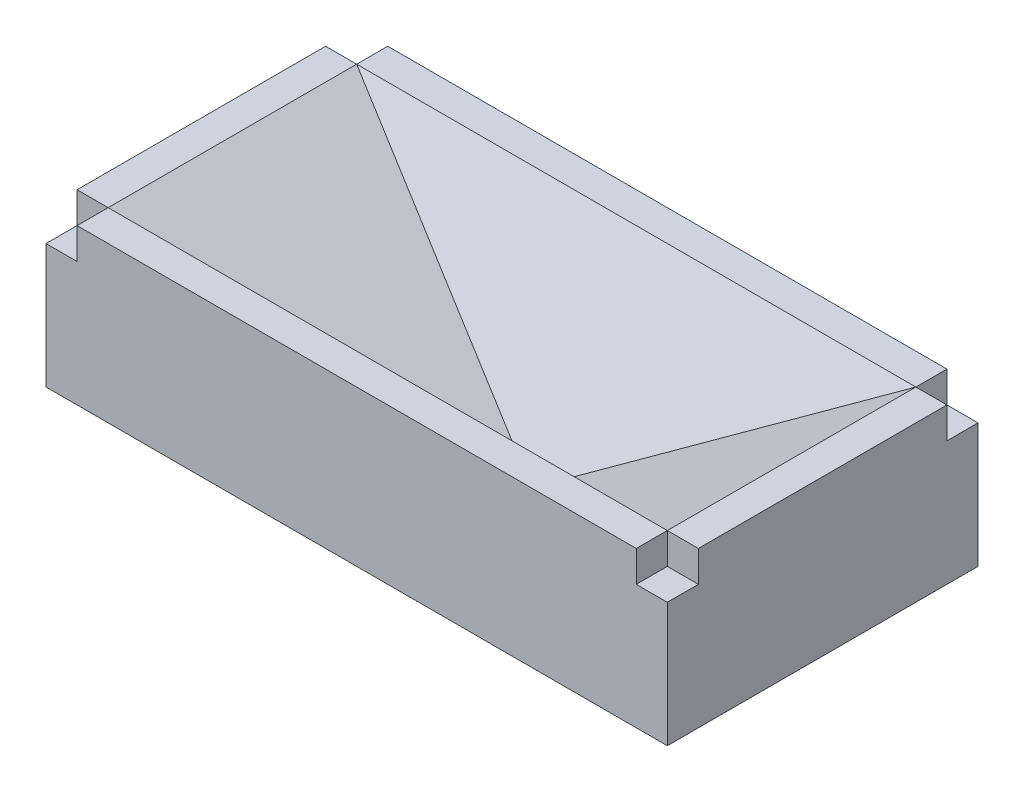
ISO-10303-21;
HEADER;
FILE_DESCRIPTION(('STEP AP214'),'2;1');
FILE_NAME('part.step','',(''),(''),'','','');
FILE_SCHEMA(('AUTOMOTIVE_DESIGN { 1 0 10303 214 1 1 1 1 }'));
ENDSEC;
DATA;
#1=APPLICATION_CONTEXT('core data for automotive mechanical design processes');
#2=APPLICATION_PROTOCOL_DEFINITION('international standard','automotive_design',2000,#1);
#3=PRODUCT_CONTEXT('',#1,'mechanical');
#4=PRODUCT('Part','Part','',(#3));
#5=PRODUCT_RELATED_PRODUCT_CATEGORY('part','',(#4));
#6=PRODUCT_DEFINITION_FORMATION('','',#4);
#7=PRODUCT_DEFINITION_CONTEXT('part definition',#1,'design');
#8=PRODUCT_DEFINITION('design','',#6,#7);
#9=PRODUCT_DEFINITION_SHAPE('','',#8);
#10=(LENGTH_UNIT() NAMED_UNIT(*) SI_UNIT(.MILLI.,.METRE.));
#11=(NAMED_UNIT(*) PLANE_ANGLE_UNIT() SI_UNIT($,.RADIAN.));
#12=(NAMED_UNIT(*) SI_UNIT($,.STERADIAN.) SOLID_ANGLE_UNIT());
#13=UNCERTAINTY_MEASURE_WITH_UNIT(LENGTH_MEASURE(1.E-05),#10,'distance_accuracy_value','');
#14=(GEOMETRIC_REPRESENTATION_CONTEXT(3) GLOBAL_UNCERTAINTY_ASSIGNED_CONTEXT((#13)) GLOBAL_UNIT_ASSIGNED_CONTEXT((#10,
#11,#12)) REPRESENTATION_CONTEXT('',''));
#15=CARTESIAN_POINT('',(0.,0.,0.));
#16=DIRECTION('',(0.,0.,1.));
#17=DIRECTION('',(1.,0.,0.));
#18=AXIS2_PLACEMENT_3D('',#15,#16,#17);
#19=CARTESIAN_POINT('',(0.,0.,0.));
#20=DIRECTION('',(0.,1.,0.));
#21=DIRECTION('',(0.,0.,1.));
#22=AXIS2_PLACEMENT_3D('',#19,#20,#21);
#23=PLANE('',#22);
#24=DIRECTION('',(1.,0.,0.));
#25=VECTOR('',#24,1.);
#26=CARTESIAN_POINT('',(45.,0.,-20.));
#27=LINE('',#26,#25);
#28=CARTESIAN_POINT('',(45.,0.,-20.));
#29=VERTEX_POINT('',#28);
#30=CARTESIAN_POINT('',(50.0000000000001,0.,-20.));
#31=VERTEX_POINT('',#30);
#32=EDGE_CURVE('E312',#29,#31,#27,.T.);
#33=ORIENTED_EDGE('',*,*,#32,.F.);
#34=DIRECTION('',(0.,0.,-1.));
#35=VECTOR('',#34,1.);
#36=CARTESIAN_POINT('',(45.,0.,-20.));
#37=LINE('',#36,#35);
#38=CARTESIAN_POINT('',(45.,0.,20.));
#39=VERTEX_POINT('',#38);
#40=EDGE_CURVE('E53',#39,#29,#37,.T.);
#41=ORIENTED_EDGE('',*,*,#40,.F.);
#42=DIRECTION('',(-1.,0.,0.));
#43=VECTOR('',#42,1.);
#44=CARTESIAN_POINT('',(50.0000000000001,0.,20.));
#45=LINE('',#44,#43);
#46=CARTESIAN_POINT('',(50.0000000000001,0.,20.));
#47=VERTEX_POINT('',#46);
#48=EDGE_CURVE('E778',#47,#39,#45,.T.);
#49=ORIENTED_EDGE('',*,*,#48,.F.);
#50=DIRECTION('',(0.,0.,-1.));
#51=VECTOR('',#50,1.);
#52=CARTESIAN_POINT('',(50.0000000000001,0.,-25.));
#53=LINE('',#52,#51);
#54=EDGE_CURVE('E739',#47,#31,#53,.T.);
#55=ORIENTED_EDGE('',*,*,#54,.T.);
#56=EDGE_LOOP('',(#33,#41,#49,#55));
#57=FACE_BOUND('',#56,.T.);
#58=ADVANCED_FACE('F49',(#57),#23,.T.);
#59=DIRECTION('',(0.,0.,1.));
#60=VECTOR('',#59,1.);
#61=CARTESIAN_POINT('',(45.,0.,-25.));
#62=LINE('',#61,#60);
#63=CARTESIAN_POINT('',(45.,0.,-25.));
#64=VERTEX_POINT('',#63);
#65=EDGE_CURVE('E806',#64,#29,#62,.T.);
#66=ORIENTED_EDGE('',*,*,#65,.F.);
#67=DIRECTION('',(-1.,0.,0.));
#68=VECTOR('',#67,1.);
#69=CARTESIAN_POINT('',(-50.,0.,-25.));
#70=LINE('',#69,#68);
#71=CARTESIAN_POINT('',(-44.9999999999999,0.,-25.));
#72=VERTEX_POINT('',#71);
#73=EDGE_CURVE('E735',#64,#72,#70,.T.);
#74=ORIENTED_EDGE('',*,*,#73,.T.);
#75=DIRECTION('',(0.,0.,-1.));
#76=VECTOR('',#75,1.);
#77=CARTESIAN_POINT('',(-44.9999999999999,0.,-25.));
#78=LINE('',#77,#76);
#79=CARTESIAN_POINT('',(-45.,0.,-20.));
#80=VERTEX_POINT('',#79);
#81=EDGE_CURVE('E289',#80,#72,#78,.T.);
#82=ORIENTED_EDGE('',*,*,#81,.F.);
#83=DIRECTION('',(-1.,0.,0.));
#84=VECTOR('',#83,1.);
#85=CARTESIAN_POINT('',(-45.,0.,-20.));
#86=LINE('',#85,#84);
#87=EDGE_CURVE('E483',#29,#80,#86,.T.);
#88=ORIENTED_EDGE('',*,*,#87,.F.);
#89=EDGE_LOOP('',(#66,#74,#82,#88));
#90=FACE_BOUND('',#89,.T.);
#91=ADVANCED_FACE('F833',(#90),#23,.T.);
#92=DIRECTION('',(1.,0.,0.));
#93=VECTOR('',#92,1.);
#94=CARTESIAN_POINT('',(-45.,0.,-20.));
#95=LINE('',#94,#93);
#96=CARTESIAN_POINT('',(-50.,0.,-20.));
#97=VERTEX_POINT('',#96);
#98=EDGE_CURVE('E329',#97,#80,#95,.T.);
#99=ORIENTED_EDGE('',*,*,#98,.F.);
#100=DIRECTION('',(0.,0.,1.));
#101=VECTOR('',#100,1.);
#102=CARTESIAN_POINT('',(-50.,0.,-25.));
#103=LINE('',#102,#101);
#104=CARTESIAN_POINT('',(-50.,0.,20.));
#105=VERTEX_POINT('',#104);
#106=EDGE_CURVE('E731',#97,#105,#103,.T.);
#107=ORIENTED_EDGE('',*,*,#106,.T.);
#108=DIRECTION('',(-1.,0.,0.));
#109=VECTOR('',#108,1.);
#110=CARTESIAN_POINT('',(-50.,0.,20.));
#111=LINE('',#110,#109);
#112=CARTESIAN_POINT('',(-44.9999999999999,0.,20.));
#113=VERTEX_POINT('',#112);
#114=EDGE_CURVE('E268',#113,#105,#111,.T.);
#115=ORIENTED_EDGE('',*,*,#114,.F.);
#116=DIRECTION('',(0.,0.,1.));
#117=VECTOR('',#116,1.);
#118=CARTESIAN_POINT('',(-45.,0.,-20.));
#119=LINE('',#118,#117);
#120=EDGE_CURVE('E585',#80,#113,#119,.T.);
#121=ORIENTED_EDGE('',*,*,#120,.F.);
#122=EDGE_LOOP('',(#99,#107,#115,#121));
#123=FACE_BOUND('',#122,.T.);
#124=ADVANCED_FACE('F645',(#123),#23,.T.);
#125=CARTESIAN_POINT('',(0.,-25.,0.));
#126=DIRECTION('',(0.,1.,0.));
#127=DIRECTION('',(0.,0.,1.));
#128=AXIS2_PLACEMENT_3D('',#125,#126,#127);
#129=PLANE('',#128);
#130=DIRECTION('',(1.,0.,0.));
#131=VECTOR('',#130,1.);
#132=CARTESIAN_POINT('',(-5.,-25.,-5.));
#133=LINE('',#132,#131);
#134=CARTESIAN_POINT('',(-5.,-25.,-5.));
#135=VERTEX_POINT('',#134);
#136=CARTESIAN_POINT('',(5.,-25.,-5.));
#137=VERTEX_POINT('',#136);
#138=EDGE_CURVE('E618',#135,#137,#133,.T.);
#139=ORIENTED_EDGE('',*,*,#138,.F.);
#140=DIRECTION('',(0.,0.,-1.));
#141=VECTOR('',#140,1.);
#142=CARTESIAN_POINT('',(-5.,-25.,5.));
#143=LINE('',#142,#141);
#144=CARTESIAN_POINT('',(-5.,-25.,5.));
#145=VERTEX_POINT('',#144);
#146=EDGE_CURVE('E606',#145,#135,#143,.T.);
#147=ORIENTED_EDGE('',*,*,#146,.F.);
#148=DIRECTION('',(-1.,0.,0.));
#149=VECTOR('',#148,1.);
#150=CARTESIAN_POINT('',(-5.,-25.,5.));
#151=LINE('',#150,#149);
#152=CARTESIAN_POINT('',(5.,-25.,5.));
#153=VERTEX_POINT('',#152);
#154=EDGE_CURVE('E596',#153,#145,#151,.T.);
#155=ORIENTED_EDGE('',*,*,#154,.F.);
#156=DIRECTION('',(0.,0.,1.));
#157=VECTOR('',#156,1.);
#158=CARTESIAN_POINT('',(5.,-25.,5.));
#159=LINE('',#158,#157);
#160=EDGE_CURVE('E524',#137,#153,#159,.T.);
#161=ORIENTED_EDGE('',*,*,#160,.F.);
#162=EDGE_LOOP('',(#139,#147,#155,#161));
#163=FACE_BOUND('',#162,.T.);
#164=DIRECTION('',(-1.,0.,0.));
#165=VECTOR('',#164,1.);
#166=CARTESIAN_POINT('',(3.2,-25.,-5.78536947653162));
#167=LINE('',#166,#165);
#168=CARTESIAN_POINT('',(3.2,-25.,-5.78536947653162));
#169=VERTEX_POINT('',#168);
#170=CARTESIAN_POINT('',(-3.2,-25.,-5.78536947653162));
#171=VERTEX_POINT('',#170);
#172=EDGE_CURVE('E443',#169,#171,#167,.T.);
#173=ORIENTED_EDGE('',*,*,#172,.F.);
#174=DIRECTION('',(0.,0.,-1.));
#175=VECTOR('',#174,1.);
#176=CARTESIAN_POINT('',(3.2,-25.,-16.));
#177=LINE('',#176,#175);
#178=CARTESIAN_POINT('',(3.2,-25.,-25.));
#179=VERTEX_POINT('',#178);
#180=EDGE_CURVE('E471',#169,#179,#177,.T.);
#181=ORIENTED_EDGE('',*,*,#180,.T.);
#182=DIRECTION('',(-1.,0.,0.));
#183=VECTOR('',#182,1.);
#184=CARTESIAN_POINT('',(-50.,-25.,-25.));
#185=LINE('',#184,#183);
#186=CARTESIAN_POINT('',(50.0000000000001,-25.,-25.));
#187=VERTEX_POINT('',#186);
#188=EDGE_CURVE('E750',#187,#179,#185,.T.);
#189=ORIENTED_EDGE('',*,*,#188,.F.);
#190=DIRECTION('',(0.,0.,-1.));
#191=VECTOR('',#190,1.);
#192=CARTESIAN_POINT('',(50.0000000000001,-25.,-25.));
#193=LINE('',#192,#191);
#194=CARTESIAN_POINT('',(50.0000000000001,-25.,25.));
#195=VERTEX_POINT('',#194);
#196=EDGE_CURVE('E730',#195,#187,#193,.T.);
#197=ORIENTED_EDGE('',*,*,#196,.F.);
#198=DIRECTION('',(1.,0.,0.));
#199=VECTOR('',#198,1.);
#200=CARTESIAN_POINT('',(-50.,-25.,25.));
#201=LINE('',#200,#199);
#202=CARTESIAN_POINT('',(-50.,-25.,25.));
#203=VERTEX_POINT('',#202);
#204=EDGE_CURVE('E722',#203,#195,#201,.T.);
#205=ORIENTED_EDGE('',*,*,#204,.F.);
#206=DIRECTION('',(0.,0.,1.));
#207=VECTOR('',#206,1.);
#208=CARTESIAN_POINT('',(-50.,-25.,-25.));
#209=LINE('',#208,#207);
#210=CARTESIAN_POINT('',(-50.,-25.,-25.));
#211=VERTEX_POINT('',#210);
#212=EDGE_CURVE('E746',#211,#203,#209,.T.);
#213=ORIENTED_EDGE('',*,*,#212,.F.);
#214=CARTESIAN_POINT('',(-3.2,-25.,-25.));
#215=VERTEX_POINT('',#214);
#216=EDGE_CURVE('E754',#215,#211,#185,.T.);
#217=ORIENTED_EDGE('',*,*,#216,.F.);
#218=DIRECTION('',(0.,0.,-1.));
#219=VECTOR('',#218,1.);
#220=CARTESIAN_POINT('',(-3.2,-25.,-16.));
#221=LINE('',#220,#219);
#222=EDGE_CURVE('E468',#171,#215,#221,.T.);
#223=ORIENTED_EDGE('',*,*,#222,.F.);
#224=EDGE_LOOP('',(#173,#181,#189,#197,#205,#213,#217,#223));
#225=FACE_BOUND('',#224,.T.);
#226=DIRECTION('',(0.,0.,-1.));
#227=VECTOR('',#226,1.);
#228=CARTESIAN_POINT('',(42.0000000000001,-25.,0.));
#229=LINE('',#228,#227);
#230=CARTESIAN_POINT('',(42.0000000000001,-25.,23.));
#231=VERTEX_POINT('',#230);
#232=CARTESIAN_POINT('',(42.0000000000001,-25.,17.));
#233=VERTEX_POINT('',#232);
#234=EDGE_CURVE('E417',#231,#233,#229,.T.);
#235=ORIENTED_EDGE('',*,*,#234,.F.);
#236=DIRECTION('',(-1.,0.,0.));
#237=VECTOR('',#236,1.);
#238=CARTESIAN_POINT('',(0.,-25.,23.));
#239=LINE('',#238,#237);
#240=CARTESIAN_POINT('',(48.0000000000001,-25.,23.));
#241=VERTEX_POINT('',#240);
#242=EDGE_CURVE('E350',#241,#231,#239,.T.);
#243=ORIENTED_EDGE('',*,*,#242,.F.);
#244=DIRECTION('',(0.,0.,-1.));
#245=VECTOR('',#244,1.);
#246=CARTESIAN_POINT('',(48.0000000000001,-25.,0.));
#247=LINE('',#246,#245);
#248=CARTESIAN_POINT('',(48.0000000000001,-25.,17.));
#249=VERTEX_POINT('',#248);
#250=EDGE_CURVE('E404',#241,#249,#247,.T.);
#251=ORIENTED_EDGE('',*,*,#250,.T.);
#252=DIRECTION('',(-1.,0.,0.));
#253=VECTOR('',#252,1.);
#254=CARTESIAN_POINT('',(0.,-25.,17.));
#255=LINE('',#254,#253);
#256=EDGE_CURVE('E421',#249,#233,#255,.T.);
#257=ORIENTED_EDGE('',*,*,#256,.T.);
#258=EDGE_LOOP('',(#235,#243,#251,#257));
#259=FACE_BOUND('',#258,.T.);
#260=DIRECTION('',(0.,0.,-1.));
#261=VECTOR('',#260,1.);
#262=CARTESIAN_POINT('',(-41.9999999999999,-25.,0.));
#263=LINE('',#262,#261);
#264=CARTESIAN_POINT('',(-41.9999999999999,-25.,23.));
#265=VERTEX_POINT('',#264);
#266=CARTESIAN_POINT('',(-41.9999999999999,-25.,17.));
#267=VERTEX_POINT('',#266);
#268=EDGE_CURVE('E370',#265,#267,#263,.T.);
#269=ORIENTED_EDGE('',*,*,#268,.T.);
#270=DIRECTION('',(1.,0.,0.));
#271=VECTOR('',#270,1.);
#272=CARTESIAN_POINT('',(0.,-25.,17.));
#273=LINE('',#272,#271);
#274=CARTESIAN_POINT('',(-47.9999999999999,-25.,17.));
#275=VERTEX_POINT('',#274);
#276=EDGE_CURVE('E358',#275,#267,#273,.T.);
#277=ORIENTED_EDGE('',*,*,#276,.F.);
#278=DIRECTION('',(0.,0.,-1.));
#279=VECTOR('',#278,1.);
#280=CARTESIAN_POINT('',(-47.9999999999999,-25.,0.));
#281=LINE('',#280,#279);
#282=CARTESIAN_POINT('',(-47.9999999999999,-25.,23.));
#283=VERTEX_POINT('',#282);
#284=EDGE_CURVE('E379',#283,#275,#281,.T.);
#285=ORIENTED_EDGE('',*,*,#284,.F.);
#286=DIRECTION('',(1.,0.,0.));
#287=VECTOR('',#286,1.);
#288=CARTESIAN_POINT('',(0.,-25.,23.));
#289=LINE('',#288,#287);
#290=EDGE_CURVE('E374',#283,#265,#289,.T.);
#291=ORIENTED_EDGE('',*,*,#290,.T.);
#292=EDGE_LOOP('',(#269,#277,#285,#291));
#293=FACE_BOUND('',#292,.T.);
#294=ADVANCED_FACE('F623',(#163,#225,#259,#293),#129,.F.);
#295=DIRECTION('',(0.,0.,-1.));
#296=VECTOR('',#295,1.);
#297=CARTESIAN_POINT('',(-44.9999999999999,0.,20.));
#298=LINE('',#297,#296);
#299=CARTESIAN_POINT('',(-44.9999999999999,0.,25.));
#300=VERTEX_POINT('',#299);
#301=EDGE_CURVE('E304',#300,#113,#298,.T.);
#302=ORIENTED_EDGE('',*,*,#301,.F.);
#303=DIRECTION('',(1.,0.,0.));
#304=VECTOR('',#303,1.);
#305=CARTESIAN_POINT('',(-50.,0.,25.));
#306=LINE('',#305,#304);
#307=CARTESIAN_POINT('',(45.,0.,25.));
#308=VERTEX_POINT('',#307);
#309=EDGE_CURVE('E274',#300,#308,#306,.T.);
#310=ORIENTED_EDGE('',*,*,#309,.T.);
#311=DIRECTION('',(0.,0.,1.));
#312=VECTOR('',#311,1.);
#313=CARTESIAN_POINT('',(45.,0.,20.));
#314=LINE('',#313,#312);
#315=EDGE_CURVE('E337',#39,#308,#314,.T.);
#316=ORIENTED_EDGE('',*,*,#315,.F.);
#317=DIRECTION('',(1.,0.,0.));
#318=VECTOR('',#317,1.);
#319=CARTESIAN_POINT('',(-45.,0.,20.));
#320=LINE('',#319,#318);
#321=EDGE_CURVE('E567',#113,#39,#320,.T.);
#322=ORIENTED_EDGE('',*,*,#321,.F.);
#323=EDGE_LOOP('',(#302,#310,#316,#322));
#324=FACE_BOUND('',#323,.T.);
#325=ADVANCED_FACE('F644',(#324),#23,.T.);
#326=CARTESIAN_POINT('',(50.0000000000001,-25.,-25.));
#327=DIRECTION('',(1.,0.,0.));
#328=DIRECTION('',(0.,0.,-1.));
#329=AXIS2_PLACEMENT_3D('',#326,#327,#328);
#330=PLANE('',#329);
#331=DIRECTION('',(0.,1.,0.));
#332=VECTOR('',#331,1.);
#333=CARTESIAN_POINT('',(50.0000000000001,-5.,-20.));
#334=LINE('',#333,#332);
#335=CARTESIAN_POINT('',(50.0000000000001,-5.,-20.));
#336=VERTEX_POINT('',#335);
#337=EDGE_CURVE('E325',#336,#31,#334,.T.);
#338=ORIENTED_EDGE('',*,*,#337,.T.);
#339=ORIENTED_EDGE('',*,*,#54,.F.);
#340=DIRECTION('',(0.,1.,0.));
#341=VECTOR('',#340,1.);
#342=CARTESIAN_POINT('',(50.0000000000001,-5.,20.));
#343=LINE('',#342,#341);
#344=CARTESIAN_POINT('',(50.0000000000001,-5.,20.));
#345=VERTEX_POINT('',#344);
#346=EDGE_CURVE('E346',#345,#47,#343,.T.);
#347=ORIENTED_EDGE('',*,*,#346,.F.);
#348=DIRECTION('',(0.,0.,-1.));
#349=VECTOR('',#348,1.);
#350=CARTESIAN_POINT('',(50.0000000000001,-5.,25.));
#351=LINE('',#350,#349);
#352=CARTESIAN_POINT('',(50.0000000000001,-5.,25.));
#353=VERTEX_POINT('',#352);
#354=EDGE_CURVE('E336',#353,#345,#351,.T.);
#355=ORIENTED_EDGE('',*,*,#354,.F.);
#356=DIRECTION('',(0.,1.,0.));
#357=VECTOR('',#356,1.);
#358=CARTESIAN_POINT('',(50.0000000000001,-25.,25.));
#359=LINE('',#358,#357);
#360=EDGE_CURVE('E12',#195,#353,#359,.T.);
#361=ORIENTED_EDGE('',*,*,#360,.F.);
#362=ORIENTED_EDGE('',*,*,#196,.T.);
#363=DIRECTION('',(0.,1.,0.));
#364=VECTOR('',#363,1.);
#365=CARTESIAN_POINT('',(50.0000000000001,-25.,-25.));
#366=LINE('',#365,#364);
#367=CARTESIAN_POINT('',(50.0000000000001,-5.,-25.));
#368=VERTEX_POINT('',#367);
#369=EDGE_CURVE('E717',#187,#368,#366,.T.);
#370=ORIENTED_EDGE('',*,*,#369,.T.);
#371=DIRECTION('',(0.,0.,-1.));
#372=VECTOR('',#371,1.);
#373=CARTESIAN_POINT('',(50.0000000000001,-5.,-20.));
#374=LINE('',#373,#372);
#375=EDGE_CURVE('E308',#336,#368,#374,.T.);
#376=ORIENTED_EDGE('',*,*,#375,.F.);
#377=EDGE_LOOP('',(#338,#339,#347,#355,#361,#362,#370,#376));
#378=FACE_BOUND('',#377,.T.);
#379=ADVANCED_FACE('F51',(#378),#330,.T.);
#380=CARTESIAN_POINT('',(-50.,-25.,25.));
#381=DIRECTION('',(0.,0.,1.));
#382=DIRECTION('',(1.,0.,0.));
#383=AXIS2_PLACEMENT_3D('',#380,#381,#382);
#384=PLANE('',#383);
#385=DIRECTION('',(0.,1.,0.));
#386=VECTOR('',#385,1.);
#387=CARTESIAN_POINT('',(-44.9999999999999,-5.,25.));
#388=LINE('',#387,#386);
#389=CARTESIAN_POINT('',(-44.9999999999999,-5.,25.));
#390=VERTEX_POINT('',#389);
#391=EDGE_CURVE('E255',#390,#300,#388,.T.);
#392=ORIENTED_EDGE('',*,*,#391,.F.);
#393=DIRECTION('',(1.,0.,0.));
#394=VECTOR('',#393,1.);
#395=CARTESIAN_POINT('',(-44.9999999999999,-5.,25.));
#396=LINE('',#395,#394);
#397=CARTESIAN_POINT('',(-50.,-5.,25.));
#398=VERTEX_POINT('',#397);
#399=EDGE_CURVE('E259',#398,#390,#396,.T.);
#400=ORIENTED_EDGE('',*,*,#399,.F.);
#401=DIRECTION('',(0.,1.,0.));
#402=VECTOR('',#401,1.);
#403=CARTESIAN_POINT('',(-50.,-25.,25.));
#404=LINE('',#403,#402);
#405=EDGE_CURVE('E60',#203,#398,#404,.T.);
#406=ORIENTED_EDGE('',*,*,#405,.F.);
#407=ORIENTED_EDGE('',*,*,#204,.T.);
#408=ORIENTED_EDGE('',*,*,#360,.T.);
#409=DIRECTION('',(1.,0.,0.));
#410=VECTOR('',#409,1.);
#411=CARTESIAN_POINT('',(45.,-5.,25.));
#412=LINE('',#411,#410);
#413=CARTESIAN_POINT('',(45.,-5.,25.));
#414=VERTEX_POINT('',#413);
#415=EDGE_CURVE('E333',#414,#353,#412,.T.);
#416=ORIENTED_EDGE('',*,*,#415,.F.);
#417=DIRECTION('',(0.,1.,0.));
#418=VECTOR('',#417,1.);
#419=CARTESIAN_POINT('',(45.,-5.,25.));
#420=LINE('',#419,#418);
#421=EDGE_CURVE('E347',#414,#308,#420,.T.);
#422=ORIENTED_EDGE('',*,*,#421,.T.);
#423=ORIENTED_EDGE('',*,*,#309,.F.);
#424=EDGE_LOOP('',(#392,#400,#406,#407,#408,#416,#422,#423));
#425=FACE_BOUND('',#424,.T.);
#426=ADVANCED_FACE('F271',(#425),#384,.T.);
#427=CARTESIAN_POINT('',(-50.,-25.,-25.));
#428=DIRECTION('',(-1.,0.,0.));
#429=DIRECTION('',(0.,0.,1.));
#430=AXIS2_PLACEMENT_3D('',#427,#428,#429);
#431=PLANE('',#430);
#432=DIRECTION('',(0.,1.,0.));
#433=VECTOR('',#432,1.);
#434=CARTESIAN_POINT('',(-50.,-5.,-20.));
#435=LINE('',#434,#433);
#436=CARTESIAN_POINT('',(-50.,-5.,-20.));
#437=VERTEX_POINT('',#436);
#438=EDGE_CURVE('E299',#437,#97,#435,.T.);
#439=ORIENTED_EDGE('',*,*,#438,.F.);
#440=DIRECTION('',(0.,0.,1.));
#441=VECTOR('',#440,1.);
#442=CARTESIAN_POINT('',(-50.,-5.,-20.));
#443=LINE('',#442,#441);
#444=CARTESIAN_POINT('',(-50.,-5.,-25.));
#445=VERTEX_POINT('',#444);
#446=EDGE_CURVE('E284',#445,#437,#443,.T.);
#447=ORIENTED_EDGE('',*,*,#446,.F.);
#448=DIRECTION('',(0.,1.,0.));
#449=VECTOR('',#448,1.);
#450=CARTESIAN_POINT('',(-50.,-25.,-25.));
#451=LINE('',#450,#449);
#452=EDGE_CURVE('E721',#211,#445,#451,.T.);
#453=ORIENTED_EDGE('',*,*,#452,.F.);
#454=ORIENTED_EDGE('',*,*,#212,.T.);
#455=ORIENTED_EDGE('',*,*,#405,.T.);
#456=DIRECTION('',(0.,0.,1.));
#457=VECTOR('',#456,1.);
#458=CARTESIAN_POINT('',(-50.,-5.,25.));
#459=LINE('',#458,#457);
#460=CARTESIAN_POINT('',(-50.,-5.,20.));
#461=VERTEX_POINT('',#460);
#462=EDGE_CURVE('E264',#461,#398,#459,.T.);
#463=ORIENTED_EDGE('',*,*,#462,.F.);
#464=DIRECTION('',(0.,1.,0.));
#465=VECTOR('',#464,1.);
#466=CARTESIAN_POINT('',(-50.,-5.,20.));
#467=LINE('',#466,#465);
#468=EDGE_CURVE('E279',#461,#105,#467,.T.);
#469=ORIENTED_EDGE('',*,*,#468,.T.);
#470=ORIENTED_EDGE('',*,*,#106,.F.);
#471=EDGE_LOOP('',(#439,#447,#453,#454,#455,#463,#469,#470));
#472=FACE_BOUND('',#471,.T.);
#473=ADVANCED_FACE('F845',(#472),#431,.T.);
#474=CARTESIAN_POINT('',(-50.,-25.,-25.));
#475=DIRECTION('',(0.,0.,-1.));
#476=DIRECTION('',(-1.,0.,0.));
#477=AXIS2_PLACEMENT_3D('',#474,#475,#476);
#478=PLANE('',#477);
#479=DIRECTION('',(0.,1.,0.));
#480=VECTOR('',#479,1.);
#481=CARTESIAN_POINT('',(45.,-5.,-25.));
#482=LINE('',#481,#480);
#483=CARTESIAN_POINT('',(45.,-5.,-25.));
#484=VERTEX_POINT('',#483);
#485=EDGE_CURVE('E324',#484,#64,#482,.T.);
#486=ORIENTED_EDGE('',*,*,#485,.F.);
#487=DIRECTION('',(-1.,0.,0.));
#488=VECTOR('',#487,1.);
#489=CARTESIAN_POINT('',(50.0000000000001,-5.,-25.));
#490=LINE('',#489,#488);
#491=EDGE_CURVE('E311',#368,#484,#490,.T.);
#492=ORIENTED_EDGE('',*,*,#491,.F.);
#493=ORIENTED_EDGE('',*,*,#369,.F.);
#494=ORIENTED_EDGE('',*,*,#188,.T.);
#495=DIRECTION('',(0.,-1.,0.));
#496=VECTOR('',#495,1.);
#497=CARTESIAN_POINT('',(3.2,-8.,-25.));
#498=LINE('',#497,#496);
#499=CARTESIAN_POINT('',(3.2,-8.,-25.));
#500=VERTEX_POINT('',#499);
#501=EDGE_CURVE('E450',#500,#179,#498,.T.);
#502=ORIENTED_EDGE('',*,*,#501,.F.);
#503=DIRECTION('',(1.,0.,0.));
#504=VECTOR('',#503,1.);
#505=CARTESIAN_POINT('',(0.,-8.,-25.));
#506=LINE('',#505,#504);
#507=CARTESIAN_POINT('',(-3.2,-8.,-25.));
#508=VERTEX_POINT('',#507);
#509=EDGE_CURVE('E455',#508,#500,#506,.T.);
#510=ORIENTED_EDGE('',*,*,#509,.F.);
#511=DIRECTION('',(0.,1.,0.));
#512=VECTOR('',#511,1.);
#513=CARTESIAN_POINT('',(-3.2,-25.,-25.));
#514=LINE('',#513,#512);
#515=EDGE_CURVE('E458',#215,#508,#514,.T.);
#516=ORIENTED_EDGE('',*,*,#515,.F.);
#517=ORIENTED_EDGE('',*,*,#216,.T.);
#518=ORIENTED_EDGE('',*,*,#452,.T.);
#519=DIRECTION('',(-1.,0.,0.));
#520=VECTOR('',#519,1.);
#521=CARTESIAN_POINT('',(-50.,-5.,-25.));
#522=LINE('',#521,#520);
#523=CARTESIAN_POINT('',(-44.9999999999999,-5.,-25.));
#524=VERTEX_POINT('',#523);
#525=EDGE_CURVE('E296',#524,#445,#522,.T.);
#526=ORIENTED_EDGE('',*,*,#525,.F.);
#527=DIRECTION('',(0.,1.,0.));
#528=VECTOR('',#527,1.);
#529=CARTESIAN_POINT('',(-44.9999999999999,-5.,-25.));
#530=LINE('',#529,#528);
#531=EDGE_CURVE('E300',#524,#72,#530,.T.);
#532=ORIENTED_EDGE('',*,*,#531,.T.);
#533=ORIENTED_EDGE('',*,*,#73,.F.);
#534=EDGE_LOOP('',(#486,#492,#493,#494,#502,#510,#516,#517,#518,#526,#532,#533));
#535=FACE_BOUND('',#534,.T.);
#536=ADVANCED_FACE('F502',(#535),#478,.T.);
#537=CARTESIAN_POINT('',(0.,-8.82352941176471,-14.7058823529412));
#538=DIRECTION('',(0.,0.514495755427527,0.857492925712544));
#539=DIRECTION('',(0.,-0.857492925712544,0.514495755427527));
#540=AXIS2_PLACEMENT_3D('',#537,#538,#539);
#541=PLANE('',#540);
#542=DIRECTION('',(-0.808122035641769,-0.505076272276105,0.303045763365663));
#543=VECTOR('',#542,1.);
#544=CARTESIAN_POINT('',(45.,0.,-20.));
#545=LINE('',#544,#543);
#546=EDGE_CURVE('E489',#29,#137,#545,.T.);
#547=ORIENTED_EDGE('',*,*,#546,.F.);
#548=ORIENTED_EDGE('',*,*,#87,.T.);
#549=DIRECTION('',(0.808122035641769,-0.505076272276105,0.303045763365663));
#550=VECTOR('',#549,1.);
#551=CARTESIAN_POINT('',(-45.,0.,-20.));
#552=LINE('',#551,#550);
#553=EDGE_CURVE('E559',#80,#135,#552,.T.);
#554=ORIENTED_EDGE('',*,*,#553,.T.);
#555=ORIENTED_EDGE('',*,*,#138,.T.);
#556=EDGE_LOOP('',(#547,#548,#554,#555));
#557=FACE_BOUND('',#556,.T.);
#558=ADVANCED_FACE('F491',(#557),#541,.T.);
#559=CARTESIAN_POINT('',(-12.6404494382022,-20.2247191011236,0.));
#560=DIRECTION('',(0.52999894000318,0.847998304005088,0.));
#561=DIRECTION('',(-0.847998304005088,0.52999894000318,0.));
#562=AXIS2_PLACEMENT_3D('',#559,#560,#561);
#563=PLANE('',#562);
#564=ORIENTED_EDGE('',*,*,#553,.F.);
#565=ORIENTED_EDGE('',*,*,#120,.T.);
#566=DIRECTION('',(0.808122035641768,-0.505076272276106,-0.303045763365663));
#567=VECTOR('',#566,1.);
#568=CARTESIAN_POINT('',(-45.,0.,20.));
#569=LINE('',#568,#567);
#570=EDGE_CURVE('E558',#113,#145,#569,.T.);
#571=ORIENTED_EDGE('',*,*,#570,.T.);
#572=ORIENTED_EDGE('',*,*,#146,.T.);
#573=EDGE_LOOP('',(#564,#565,#571,#572));
#574=FACE_BOUND('',#573,.T.);
#575=ADVANCED_FACE('F501',(#574),#563,.T.);
#576=CARTESIAN_POINT('',(12.6404494382023,-20.2247191011236,0.));
#577=DIRECTION('',(-0.52999894000318,0.847998304005088,0.));
#578=DIRECTION('',(-0.847998304005088,-0.52999894000318,0.));
#579=AXIS2_PLACEMENT_3D('',#576,#577,#578);
#580=PLANE('',#579);
#581=DIRECTION('',(-0.808122035641769,-0.505076272276105,-0.303045763365663));
#582=VECTOR('',#581,1.);
#583=CARTESIAN_POINT('',(45.,0.,20.));
#584=LINE('',#583,#582);
#585=EDGE_CURVE('E550',#39,#153,#584,.T.);
#586=ORIENTED_EDGE('',*,*,#585,.F.);
#587=ORIENTED_EDGE('',*,*,#40,.T.);
#588=ORIENTED_EDGE('',*,*,#546,.T.);
#589=ORIENTED_EDGE('',*,*,#160,.T.);
#590=EDGE_LOOP('',(#586,#587,#588,#589));
#591=FACE_BOUND('',#590,.T.);
#592=ADVANCED_FACE('F530',(#591),#580,.T.);
#593=CARTESIAN_POINT('',(0.,-8.82352941176471,14.7058823529412));
#594=DIRECTION('',(0.,0.514495755427527,-0.857492925712544));
#595=DIRECTION('',(0.,0.857492925712544,0.514495755427527));
#596=AXIS2_PLACEMENT_3D('',#593,#594,#595);
#597=PLANE('',#596);
#598=ORIENTED_EDGE('',*,*,#570,.F.);
#599=ORIENTED_EDGE('',*,*,#321,.T.);
#600=ORIENTED_EDGE('',*,*,#585,.T.);
#601=ORIENTED_EDGE('',*,*,#154,.T.);
#602=EDGE_LOOP('',(#598,#599,#600,#601));
#603=FACE_BOUND('',#602,.T.);
#604=ADVANCED_FACE('F539',(#603),#597,.T.);
#605=CARTESIAN_POINT('',(0.,-8.,-16.));
#606=DIRECTION('',(0.,1.,0.));
#607=DIRECTION('',(0.,0.,1.));
#608=AXIS2_PLACEMENT_3D('',#605,#606,#607);
#609=PLANE('',#608);
#610=ORIENTED_EDGE('',*,*,#509,.T.);
#611=DIRECTION('',(0.,0.,-1.));
#612=VECTOR('',#611,1.);
#613=CARTESIAN_POINT('',(3.2,-8.,-16.));
#614=LINE('',#613,#612);
#615=CARTESIAN_POINT('',(3.2,-8.,-16.));
#616=VERTEX_POINT('',#615);
#617=EDGE_CURVE('E454',#616,#500,#614,.T.);
#618=ORIENTED_EDGE('',*,*,#617,.F.);
#619=DIRECTION('',(1.,0.,0.));
#620=VECTOR('',#619,1.);
#621=CARTESIAN_POINT('',(0.,-8.,-16.));
#622=LINE('',#621,#620);
#623=CARTESIAN_POINT('',(-3.2,-8.,-16.));
#624=VERTEX_POINT('',#623);
#625=EDGE_CURVE('E451',#624,#616,#622,.T.);
#626=ORIENTED_EDGE('',*,*,#625,.F.);
#627=DIRECTION('',(0.,0.,-1.));
#628=VECTOR('',#627,1.);
#629=CARTESIAN_POINT('',(-3.2,-8.,-16.));
#630=LINE('',#629,#628);
#631=EDGE_CURVE('E465',#624,#508,#630,.T.);
#632=ORIENTED_EDGE('',*,*,#631,.T.);
#633=EDGE_LOOP('',(#610,#618,#626,#632));
#634=FACE_BOUND('',#633,.T.);
#635=ADVANCED_FACE('F1115',(#634),#609,.F.);
#636=CARTESIAN_POINT('',(-3.2,-25.,-16.));
#637=DIRECTION('',(-1.,0.,0.));
#638=DIRECTION('',(0.,-1.,0.));
#639=AXIS2_PLACEMENT_3D('',#636,#637,#638);
#640=PLANE('',#639);
#641=ORIENTED_EDGE('',*,*,#515,.T.);
#642=ORIENTED_EDGE('',*,*,#631,.F.);
#643=DIRECTION('',(0.,-0.857167300702116,0.515038074910049));
#644=VECTOR('',#643,1.);
#645=CARTESIAN_POINT('',(-3.2,-9.18569449172776,-15.2875628737229));
#646=LINE('',#645,#644);
#647=EDGE_CURVE('E389',#624,#171,#646,.T.);
#648=ORIENTED_EDGE('',*,*,#647,.T.);
#649=ORIENTED_EDGE('',*,*,#222,.T.);
#650=EDGE_LOOP('',(#641,#642,#648,#649));
#651=FACE_BOUND('',#650,.T.);
#652=ADVANCED_FACE('F1117',(#651),#640,.F.);
#653=CARTESIAN_POINT('',(3.2,-8.,-16.));
#654=DIRECTION('',(1.,0.,0.));
#655=DIRECTION('',(0.,1.,0.));
#656=AXIS2_PLACEMENT_3D('',#653,#654,#655);
#657=PLANE('',#656);
#658=ORIENTED_EDGE('',*,*,#501,.T.);
#659=ORIENTED_EDGE('',*,*,#180,.F.);
#660=DIRECTION('',(0.,-0.857167300702116,0.515038074910049));
#661=VECTOR('',#660,1.);
#662=CARTESIAN_POINT('',(3.2,-9.18569449172776,-15.2875628737229));
#663=LINE('',#662,#661);
#664=EDGE_CURVE('E439',#616,#169,#663,.T.);
#665=ORIENTED_EDGE('',*,*,#664,.F.);
#666=ORIENTED_EDGE('',*,*,#617,.T.);
#667=EDGE_LOOP('',(#658,#659,#665,#666));
#668=FACE_BOUND('',#667,.T.);
#669=ADVANCED_FACE('F503',(#668),#657,.F.);
#670=CARTESIAN_POINT('',(3.2,-9.18569449172776,-15.2875628737229));
#671=DIRECTION('',(0.,-0.515038074910049,-0.857167300702116));
#672=DIRECTION('',(0.,0.857167300702116,-0.515038074910049));
#673=AXIS2_PLACEMENT_3D('',#670,#671,#672);
#674=PLANE('',#673);
#675=ORIENTED_EDGE('',*,*,#647,.F.);
#676=ORIENTED_EDGE('',*,*,#625,.T.);
#677=ORIENTED_EDGE('',*,*,#664,.T.);
#678=ORIENTED_EDGE('',*,*,#172,.T.);
#679=EDGE_LOOP('',(#675,#676,#677,#678));
#680=FACE_BOUND('',#679,.T.);
#681=ADVANCED_FACE('F909',(#680),#674,.T.);
#682=CARTESIAN_POINT('',(0.,-19.,23.));
#683=DIRECTION('',(0.,0.,1.));
#684=DIRECTION('',(1.,0.,0.));
#685=AXIS2_PLACEMENT_3D('',#682,#683,#684);
#686=PLANE('',#685);
#687=ORIENTED_EDGE('',*,*,#242,.T.);
#688=DIRECTION('',(0.,-1.,0.));
#689=VECTOR('',#688,1.);
#690=CARTESIAN_POINT('',(42.0000000000001,-19.,23.));
#691=LINE('',#690,#689);
#692=CARTESIAN_POINT('',(42.0000000000001,-19.,23.));
#693=VERTEX_POINT('',#692);
#694=EDGE_CURVE('E414',#693,#231,#691,.T.);
#695=ORIENTED_EDGE('',*,*,#694,.F.);
#696=DIRECTION('',(-1.,0.,0.));
#697=VECTOR('',#696,1.);
#698=CARTESIAN_POINT('',(0.,-19.,23.));
#699=LINE('',#698,#697);
#700=CARTESIAN_POINT('',(48.0000000000001,-19.,23.));
#701=VERTEX_POINT('',#700);
#702=EDGE_CURVE('E399',#701,#693,#699,.T.);
#703=ORIENTED_EDGE('',*,*,#702,.F.);
#704=DIRECTION('',(0.,-1.,0.));
#705=VECTOR('',#704,1.);
#706=CARTESIAN_POINT('',(48.0000000000001,-19.,23.));
#707=LINE('',#706,#705);
#708=EDGE_CURVE('E375',#701,#241,#707,.T.);
#709=ORIENTED_EDGE('',*,*,#708,.T.);
#710=EDGE_LOOP('',(#687,#695,#703,#709));
#711=FACE_BOUND('',#710,.T.);
#712=ADVANCED_FACE('F913',(#711),#686,.F.);
#713=CARTESIAN_POINT('',(48.0000000000001,-19.,0.));
#714=DIRECTION('',(-1.,0.,0.));
#715=DIRECTION('',(0.,0.,1.));
#716=AXIS2_PLACEMENT_3D('',#713,#714,#715);
#717=PLANE('',#716);
#718=ORIENTED_EDGE('',*,*,#250,.F.);
#719=ORIENTED_EDGE('',*,*,#708,.F.);
#720=DIRECTION('',(0.,0.,-1.));
#721=VECTOR('',#720,1.);
#722=CARTESIAN_POINT('',(48.0000000000001,-19.,0.));
#723=LINE('',#722,#721);
#724=CARTESIAN_POINT('',(48.0000000000001,-19.,17.));
#725=VERTEX_POINT('',#724);
#726=EDGE_CURVE('E411',#701,#725,#723,.T.);
#727=ORIENTED_EDGE('',*,*,#726,.T.);
#728=DIRECTION('',(0.,-1.,0.));
#729=VECTOR('',#728,1.);
#730=CARTESIAN_POINT('',(48.0000000000001,-19.,17.));
#731=LINE('',#730,#729);
#732=EDGE_CURVE('E430',#725,#249,#731,.T.);
#733=ORIENTED_EDGE('',*,*,#732,.T.);
#734=EDGE_LOOP('',(#718,#719,#727,#733));
#735=FACE_BOUND('',#734,.T.);
#736=ADVANCED_FACE('F917',(#735),#717,.T.);
#737=CARTESIAN_POINT('',(0.,-19.,17.));
#738=DIRECTION('',(0.,0.,1.));
#739=DIRECTION('',(1.,0.,0.));
#740=AXIS2_PLACEMENT_3D('',#737,#738,#739);
#741=PLANE('',#740);
#742=ORIENTED_EDGE('',*,*,#256,.F.);
#743=ORIENTED_EDGE('',*,*,#732,.F.);
#744=DIRECTION('',(-1.,0.,0.));
#745=VECTOR('',#744,1.);
#746=CARTESIAN_POINT('',(0.,-19.,17.));
#747=LINE('',#746,#745);
#748=CARTESIAN_POINT('',(42.0000000000001,-19.,17.));
#749=VERTEX_POINT('',#748);
#750=EDGE_CURVE('E408',#725,#749,#747,.T.);
#751=ORIENTED_EDGE('',*,*,#750,.T.);
#752=DIRECTION('',(0.,-1.,0.));
#753=VECTOR('',#752,1.);
#754=CARTESIAN_POINT('',(42.0000000000001,-19.,17.));
#755=LINE('',#754,#753);
#756=EDGE_CURVE('E433',#749,#233,#755,.T.);
#757=ORIENTED_EDGE('',*,*,#756,.T.);
#758=EDGE_LOOP('',(#742,#743,#751,#757));
#759=FACE_BOUND('',#758,.T.);
#760=ADVANCED_FACE('F927',(#759),#741,.T.);
#761=CARTESIAN_POINT('',(42.0000000000001,-19.,0.));
#762=DIRECTION('',(-1.,0.,0.));
#763=DIRECTION('',(0.,0.,1.));
#764=AXIS2_PLACEMENT_3D('',#761,#762,#763);
#765=PLANE('',#764);
#766=ORIENTED_EDGE('',*,*,#234,.T.);
#767=ORIENTED_EDGE('',*,*,#756,.F.);
#768=DIRECTION('',(0.,0.,-1.));
#769=VECTOR('',#768,1.);
#770=CARTESIAN_POINT('',(42.0000000000001,-19.,0.));
#771=LINE('',#770,#769);
#772=EDGE_CURVE('E403',#693,#749,#771,.T.);
#773=ORIENTED_EDGE('',*,*,#772,.F.);
#774=ORIENTED_EDGE('',*,*,#694,.T.);
#775=EDGE_LOOP('',(#766,#767,#773,#774));
#776=FACE_BOUND('',#775,.T.);
#777=ADVANCED_FACE('F937',(#776),#765,.F.);
#778=CARTESIAN_POINT('',(0.,-19.,0.));
#779=DIRECTION('',(0.,-1.,0.));
#780=DIRECTION('',(0.,0.,-1.));
#781=AXIS2_PLACEMENT_3D('',#778,#779,#780);
#782=PLANE('',#781);
#783=ORIENTED_EDGE('',*,*,#702,.T.);
#784=ORIENTED_EDGE('',*,*,#772,.T.);
#785=ORIENTED_EDGE('',*,*,#750,.F.);
#786=ORIENTED_EDGE('',*,*,#726,.F.);
#787=EDGE_LOOP('',(#783,#784,#785,#786));
#788=FACE_BOUND('',#787,.T.);
#789=ADVANCED_FACE('F947',(#788),#782,.T.);
#790=CARTESIAN_POINT('',(-41.9999999999999,-19.,0.));
#791=DIRECTION('',(-1.,0.,0.));
#792=DIRECTION('',(0.,0.,1.));
#793=AXIS2_PLACEMENT_3D('',#790,#791,#792);
#794=PLANE('',#793);
#795=ORIENTED_EDGE('',*,*,#268,.F.);
#796=DIRECTION('',(0.,-1.,0.));
#797=VECTOR('',#796,1.);
#798=CARTESIAN_POINT('',(-41.9999999999999,-19.,23.));
#799=LINE('',#798,#797);
#800=CARTESIAN_POINT('',(-41.9999999999999,-19.,23.));
#801=VERTEX_POINT('',#800);
#802=EDGE_CURVE('E369',#801,#265,#799,.T.);
#803=ORIENTED_EDGE('',*,*,#802,.F.);
#804=DIRECTION('',(0.,0.,-1.));
#805=VECTOR('',#804,1.);
#806=CARTESIAN_POINT('',(-41.9999999999999,-19.,0.));
#807=LINE('',#806,#805);
#808=CARTESIAN_POINT('',(-41.9999999999999,-19.,17.));
#809=VERTEX_POINT('',#808);
#810=EDGE_CURVE('E354',#801,#809,#807,.T.);
#811=ORIENTED_EDGE('',*,*,#810,.T.);
#812=DIRECTION('',(0.,-1.,0.));
#813=VECTOR('',#812,1.);
#814=CARTESIAN_POINT('',(-41.9999999999999,-19.,17.));
#815=LINE('',#814,#813);
#816=EDGE_CURVE('E386',#809,#267,#815,.T.);
#817=ORIENTED_EDGE('',*,*,#816,.T.);
#818=EDGE_LOOP('',(#795,#803,#811,#817));
#819=FACE_BOUND('',#818,.T.);
#820=ADVANCED_FACE('F957',(#819),#794,.T.);
#821=CARTESIAN_POINT('',(0.,-19.,17.));
#822=DIRECTION('',(0.,0.,-1.));
#823=DIRECTION('',(-1.,0.,0.));
#824=AXIS2_PLACEMENT_3D('',#821,#822,#823);
#825=PLANE('',#824);
#826=ORIENTED_EDGE('',*,*,#276,.T.);
#827=ORIENTED_EDGE('',*,*,#816,.F.);
#828=DIRECTION('',(1.,0.,0.));
#829=VECTOR('',#828,1.);
#830=CARTESIAN_POINT('',(0.,-19.,17.));
#831=LINE('',#830,#829);
#832=CARTESIAN_POINT('',(-47.9999999999999,-19.,17.));
#833=VERTEX_POINT('',#832);
#834=EDGE_CURVE('E365',#833,#809,#831,.T.);
#835=ORIENTED_EDGE('',*,*,#834,.F.);
#836=DIRECTION('',(0.,-1.,0.));
#837=VECTOR('',#836,1.);
#838=CARTESIAN_POINT('',(-47.9999999999999,-19.,17.));
#839=LINE('',#838,#837);
#840=EDGE_CURVE('E390',#833,#275,#839,.T.);
#841=ORIENTED_EDGE('',*,*,#840,.T.);
#842=EDGE_LOOP('',(#826,#827,#835,#841));
#843=FACE_BOUND('',#842,.T.);
#844=ADVANCED_FACE('F967',(#843),#825,.F.);
#845=CARTESIAN_POINT('',(-47.9999999999999,-19.,0.));
#846=DIRECTION('',(-1.,0.,0.));
#847=DIRECTION('',(0.,0.,1.));
#848=AXIS2_PLACEMENT_3D('',#845,#846,#847);
#849=PLANE('',#848);
#850=ORIENTED_EDGE('',*,*,#284,.T.);
#851=ORIENTED_EDGE('',*,*,#840,.F.);
#852=DIRECTION('',(0.,0.,-1.));
#853=VECTOR('',#852,1.);
#854=CARTESIAN_POINT('',(-47.9999999999999,-19.,0.));
#855=LINE('',#854,#853);
#856=CARTESIAN_POINT('',(-47.9999999999999,-19.,23.));
#857=VERTEX_POINT('',#856);
#858=EDGE_CURVE('E361',#857,#833,#855,.T.);
#859=ORIENTED_EDGE('',*,*,#858,.F.);
#860=DIRECTION('',(0.,-1.,0.));
#861=VECTOR('',#860,1.);
#862=CARTESIAN_POINT('',(-47.9999999999999,-19.,23.));
#863=LINE('',#862,#861);
#864=EDGE_CURVE('E393',#857,#283,#863,.T.);
#865=ORIENTED_EDGE('',*,*,#864,.T.);
#866=EDGE_LOOP('',(#850,#851,#859,#865));
#867=FACE_BOUND('',#866,.T.);
#868=ADVANCED_FACE('F977',(#867),#849,.F.);
#869=CARTESIAN_POINT('',(0.,-19.,23.));
#870=DIRECTION('',(0.,0.,-1.));
#871=DIRECTION('',(-1.,0.,0.));
#872=AXIS2_PLACEMENT_3D('',#869,#870,#871);
#873=PLANE('',#872);
#874=ORIENTED_EDGE('',*,*,#290,.F.);
#875=ORIENTED_EDGE('',*,*,#864,.F.);
#876=DIRECTION('',(1.,0.,0.));
#877=VECTOR('',#876,1.);
#878=CARTESIAN_POINT('',(0.,-19.,23.));
#879=LINE('',#878,#877);
#880=EDGE_CURVE('E357',#857,#801,#879,.T.);
#881=ORIENTED_EDGE('',*,*,#880,.T.);
#882=ORIENTED_EDGE('',*,*,#802,.T.);
#883=EDGE_LOOP('',(#874,#875,#881,#882));
#884=FACE_BOUND('',#883,.T.);
#885=ADVANCED_FACE('F987',(#884),#873,.T.);
#886=CARTESIAN_POINT('',(0.,-19.,0.));
#887=DIRECTION('',(0.,-1.,0.));
#888=DIRECTION('',(0.,0.,-1.));
#889=AXIS2_PLACEMENT_3D('',#886,#887,#888);
#890=PLANE('',#889);
#891=ORIENTED_EDGE('',*,*,#810,.F.);
#892=ORIENTED_EDGE('',*,*,#880,.F.);
#893=ORIENTED_EDGE('',*,*,#858,.T.);
#894=ORIENTED_EDGE('',*,*,#834,.T.);
#895=EDGE_LOOP('',(#891,#892,#893,#894));
#896=FACE_BOUND('',#895,.T.);
#897=ADVANCED_FACE('F997',(#896),#890,.T.);
#898=CARTESIAN_POINT('',(-44.9999999999999,-5.,-25.));
#899=DIRECTION('',(1.,0.,0.));
#900=DIRECTION('',(0.,0.,-1.));
#901=AXIS2_PLACEMENT_3D('',#898,#899,#900);
#902=PLANE('',#901);
#903=ORIENTED_EDGE('',*,*,#81,.T.);
#904=ORIENTED_EDGE('',*,*,#531,.F.);
#905=DIRECTION('',(0.,0.,-1.));
#906=VECTOR('',#905,1.);
#907=CARTESIAN_POINT('',(-44.9999999999999,-5.,-25.));
#908=LINE('',#907,#906);
#909=CARTESIAN_POINT('',(-45.,-5.,-20.));
#910=VERTEX_POINT('',#909);
#911=EDGE_CURVE('E293',#910,#524,#908,.T.);
#912=ORIENTED_EDGE('',*,*,#911,.F.);
#913=DIRECTION('',(0.,1.,0.));
#914=VECTOR('',#913,1.);
#915=CARTESIAN_POINT('',(-45.,-5.,-20.));
#916=LINE('',#915,#914);
#917=EDGE_CURVE('E305',#910,#80,#916,.T.);
#918=ORIENTED_EDGE('',*,*,#917,.T.);
#919=EDGE_LOOP('',(#903,#904,#912,#918));
#920=FACE_BOUND('',#919,.T.);
#921=ADVANCED_FACE('F827',(#920),#902,.F.);
#922=CARTESIAN_POINT('',(-45.,-5.,-20.));
#923=DIRECTION('',(0.,0.,1.));
#924=DIRECTION('',(1.,0.,0.));
#925=AXIS2_PLACEMENT_3D('',#922,#923,#924);
#926=PLANE('',#925);
#927=ORIENTED_EDGE('',*,*,#98,.T.);
#928=ORIENTED_EDGE('',*,*,#917,.F.);
#929=DIRECTION('',(1.,0.,0.));
#930=VECTOR('',#929,1.);
#931=CARTESIAN_POINT('',(-45.,-5.,-20.));
#932=LINE('',#931,#930);
#933=EDGE_CURVE('E288',#437,#910,#932,.T.);
#934=ORIENTED_EDGE('',*,*,#933,.F.);
#935=ORIENTED_EDGE('',*,*,#438,.T.);
#936=EDGE_LOOP('',(#927,#928,#934,#935));
#937=FACE_BOUND('',#936,.T.);
#938=ADVANCED_FACE('F848',(#937),#926,.F.);
#939=CARTESIAN_POINT('',(0.,-5.,0.));
#940=DIRECTION('',(0.,-1.,0.));
#941=DIRECTION('',(0.,0.,-1.));
#942=AXIS2_PLACEMENT_3D('',#939,#940,#941);
#943=PLANE('',#942);
#944=ORIENTED_EDGE('',*,*,#446,.T.);
#945=ORIENTED_EDGE('',*,*,#933,.T.);
#946=ORIENTED_EDGE('',*,*,#911,.T.);
#947=ORIENTED_EDGE('',*,*,#525,.T.);
#948=EDGE_LOOP('',(#944,#945,#946,#947));
#949=FACE_BOUND('',#948,.T.);
#950=ADVANCED_FACE('F875',(#949),#943,.F.);
#951=CARTESIAN_POINT('',(45.,-5.,-20.));
#952=DIRECTION('',(0.,0.,1.));
#953=DIRECTION('',(1.,0.,0.));
#954=AXIS2_PLACEMENT_3D('',#951,#952,#953);
#955=PLANE('',#954);
#956=ORIENTED_EDGE('',*,*,#32,.T.);
#957=ORIENTED_EDGE('',*,*,#337,.F.);
#958=DIRECTION('',(1.,0.,0.));
#959=VECTOR('',#958,1.);
#960=CARTESIAN_POINT('',(45.,-5.,-20.));
#961=LINE('',#960,#959);
#962=CARTESIAN_POINT('',(45.,-5.,-20.));
#963=VERTEX_POINT('',#962);
#964=EDGE_CURVE('E320',#963,#336,#961,.T.);
#965=ORIENTED_EDGE('',*,*,#964,.F.);
#966=DIRECTION('',(0.,1.,0.));
#967=VECTOR('',#966,1.);
#968=CARTESIAN_POINT('',(45.,-5.,-20.));
#969=LINE('',#968,#967);
#970=EDGE_CURVE('E330',#963,#29,#969,.T.);
#971=ORIENTED_EDGE('',*,*,#970,.T.);
#972=EDGE_LOOP('',(#956,#957,#965,#971));
#973=FACE_BOUND('',#972,.T.);
#974=ADVANCED_FACE('F873',(#973),#955,.F.);
#975=CARTESIAN_POINT('',(45.,-5.,-25.));
#976=DIRECTION('',(-1.,0.,0.));
#977=DIRECTION('',(0.,0.,1.));
#978=AXIS2_PLACEMENT_3D('',#975,#976,#977);
#979=PLANE('',#978);
#980=ORIENTED_EDGE('',*,*,#65,.T.);
#981=ORIENTED_EDGE('',*,*,#970,.F.);
#982=DIRECTION('',(0.,0.,1.));
#983=VECTOR('',#982,1.);
#984=CARTESIAN_POINT('',(45.,-5.,-25.));
#985=LINE('',#984,#983);
#986=EDGE_CURVE('E316',#484,#963,#985,.T.);
#987=ORIENTED_EDGE('',*,*,#986,.F.);
#988=ORIENTED_EDGE('',*,*,#485,.T.);
#989=EDGE_LOOP('',(#980,#981,#987,#988));
#990=FACE_BOUND('',#989,.T.);
#991=ADVANCED_FACE('F835',(#990),#979,.F.);
#992=CARTESIAN_POINT('',(0.,-5.,0.));
#993=DIRECTION('',(0.,1.,0.));
#994=DIRECTION('',(0.,0.,1.));
#995=AXIS2_PLACEMENT_3D('',#992,#993,#994);
#996=PLANE('',#995);
#997=ORIENTED_EDGE('',*,*,#375,.T.);
#998=ORIENTED_EDGE('',*,*,#491,.T.);
#999=ORIENTED_EDGE('',*,*,#986,.T.);
#1000=ORIENTED_EDGE('',*,*,#964,.T.);
#1001=EDGE_LOOP('',(#997,#998,#999,#1000));
#1002=FACE_BOUND('',#1001,.T.);
#1003=ADVANCED_FACE('F871',(#1002),#996,.T.);
#1004=CARTESIAN_POINT('',(-50.,-5.,20.));
#1005=DIRECTION('',(0.,0.,-1.));
#1006=DIRECTION('',(-1.,0.,0.));
#1007=AXIS2_PLACEMENT_3D('',#1004,#1005,#1006);
#1008=PLANE('',#1007);
#1009=ORIENTED_EDGE('',*,*,#114,.T.);
#1010=ORIENTED_EDGE('',*,*,#468,.F.);
#1011=DIRECTION('',(-1.,0.,0.));
#1012=VECTOR('',#1011,1.);
#1013=CARTESIAN_POINT('',(-50.,-5.,20.));
#1014=LINE('',#1013,#1012);
#1015=CARTESIAN_POINT('',(-44.9999999999999,-5.,20.));
#1016=VERTEX_POINT('',#1015);
#1017=EDGE_CURVE('E76',#1016,#461,#1014,.T.);
#1018=ORIENTED_EDGE('',*,*,#1017,.F.);
#1019=DIRECTION('',(0.,1.,0.));
#1020=VECTOR('',#1019,1.);
#1021=CARTESIAN_POINT('',(-44.9999999999999,-5.,20.));
#1022=LINE('',#1021,#1020);
#1023=EDGE_CURVE('E257',#1016,#113,#1022,.T.);
#1024=ORIENTED_EDGE('',*,*,#1023,.T.);
#1025=EDGE_LOOP('',(#1009,#1010,#1018,#1024));
#1026=FACE_BOUND('',#1025,.T.);
#1027=ADVANCED_FACE('F1056',(#1026),#1008,.F.);
#1028=CARTESIAN_POINT('',(-44.9999999999999,-5.,20.));
#1029=DIRECTION('',(1.,0.,0.));
#1030=DIRECTION('',(0.,0.,-1.));
#1031=AXIS2_PLACEMENT_3D('',#1028,#1029,#1030);
#1032=PLANE('',#1031);
#1033=ORIENTED_EDGE('',*,*,#301,.T.);
#1034=ORIENTED_EDGE('',*,*,#1023,.F.);
#1035=DIRECTION('',(0.,0.,-1.));
#1036=VECTOR('',#1035,1.);
#1037=CARTESIAN_POINT('',(-44.9999999999999,-5.,20.));
#1038=LINE('',#1037,#1036);
#1039=EDGE_CURVE('E250',#390,#1016,#1038,.T.);
#1040=ORIENTED_EDGE('',*,*,#1039,.F.);
#1041=ORIENTED_EDGE('',*,*,#391,.T.);
#1042=EDGE_LOOP('',(#1033,#1034,#1040,#1041));
#1043=FACE_BOUND('',#1042,.T.);
#1044=ADVANCED_FACE('F253',(#1043),#1032,.F.);
#1045=CARTESIAN_POINT('',(0.,-5.,0.));
#1046=DIRECTION('',(0.,-1.,0.));
#1047=DIRECTION('',(0.,0.,-1.));
#1048=AXIS2_PLACEMENT_3D('',#1045,#1046,#1047);
#1049=PLANE('',#1048);
#1050=ORIENTED_EDGE('',*,*,#399,.T.);
#1051=ORIENTED_EDGE('',*,*,#1039,.T.);
#1052=ORIENTED_EDGE('',*,*,#1017,.T.);
#1053=ORIENTED_EDGE('',*,*,#462,.T.);
#1054=EDGE_LOOP('',(#1050,#1051,#1052,#1053));
#1055=FACE_BOUND('',#1054,.T.);
#1056=ADVANCED_FACE('F262',(#1055),#1049,.F.);
#1057=CARTESIAN_POINT('',(45.,-5.,20.));
#1058=DIRECTION('',(-1.,0.,0.));
#1059=DIRECTION('',(0.,0.,1.));
#1060=AXIS2_PLACEMENT_3D('',#1057,#1058,#1059);
#1061=PLANE('',#1060);
#1062=ORIENTED_EDGE('',*,*,#315,.T.);
#1063=ORIENTED_EDGE('',*,*,#421,.F.);
#1064=DIRECTION('',(0.,0.,1.));
#1065=VECTOR('',#1064,1.);
#1066=CARTESIAN_POINT('',(45.,-5.,20.));
#1067=LINE('',#1066,#1065);
#1068=CARTESIAN_POINT('',(45.,-5.,20.));
#1069=VERTEX_POINT('',#1068);
#1070=EDGE_CURVE('E68',#1069,#414,#1067,.T.);
#1071=ORIENTED_EDGE('',*,*,#1070,.F.);
#1072=DIRECTION('',(0.,1.,0.));
#1073=VECTOR('',#1072,1.);
#1074=CARTESIAN_POINT('',(45.,-5.,20.));
#1075=LINE('',#1074,#1073);
#1076=EDGE_CURVE('E351',#1069,#39,#1075,.T.);
#1077=ORIENTED_EDGE('',*,*,#1076,.T.);
#1078=EDGE_LOOP('',(#1062,#1063,#1071,#1077));
#1079=FACE_BOUND('',#1078,.T.);
#1080=ADVANCED_FACE('F1077',(#1079),#1061,.F.);
#1081=CARTESIAN_POINT('',(50.0000000000001,-5.,20.));
#1082=DIRECTION('',(0.,0.,-1.));
#1083=DIRECTION('',(-1.,0.,0.));
#1084=AXIS2_PLACEMENT_3D('',#1081,#1082,#1083);
#1085=PLANE('',#1084);
#1086=ORIENTED_EDGE('',*,*,#48,.T.);
#1087=ORIENTED_EDGE('',*,*,#1076,.F.);
#1088=DIRECTION('',(-1.,0.,0.));
#1089=VECTOR('',#1088,1.);
#1090=CARTESIAN_POINT('',(50.0000000000001,-5.,20.));
#1091=LINE('',#1090,#1089);
#1092=EDGE_CURVE('E341',#345,#1069,#1091,.T.);
#1093=ORIENTED_EDGE('',*,*,#1092,.F.);
#1094=ORIENTED_EDGE('',*,*,#346,.T.);
#1095=EDGE_LOOP('',(#1086,#1087,#1093,#1094));
#1096=FACE_BOUND('',#1095,.T.);
#1097=ADVANCED_FACE('F1085',(#1096),#1085,.F.);
#1098=CARTESIAN_POINT('',(0.,-5.,0.));
#1099=DIRECTION('',(0.,1.,0.));
#1100=DIRECTION('',(0.,0.,1.));
#1101=AXIS2_PLACEMENT_3D('',#1098,#1099,#1100);
#1102=PLANE('',#1101);
#1103=ORIENTED_EDGE('',*,*,#415,.T.);
#1104=ORIENTED_EDGE('',*,*,#354,.T.);
#1105=ORIENTED_EDGE('',*,*,#1092,.T.);
#1106=ORIENTED_EDGE('',*,*,#1070,.T.);
#1107=EDGE_LOOP('',(#1103,#1104,#1105,#1106));
#1108=FACE_BOUND('',#1107,.T.);
#1109=ADVANCED_FACE('F1094',(#1108),#1102,.T.);
#1110=CLOSED_SHELL('',(#58,#91,#124,#294,#325,#379,#426,#473,#536,#558,#575,#592,#604,#635,#652,
#669,#681,#712,#736,#760,#777,#789,#820,#844,#868,#885,#897,#921,#938,#950,#974,#991,#1003,
#1027,#1044,#1056,#1080,#1097,#1109));
#1111=MANIFOLD_SOLID_BREP('B2',#1110);
#1112=ADVANCED_BREP_SHAPE_REPRESENTATION('',(#18,#1111),#14);
#1113=SHAPE_DEFINITION_REPRESENTATION(#9,#1112);
ENDSEC;
END-ISO-10303-21;
